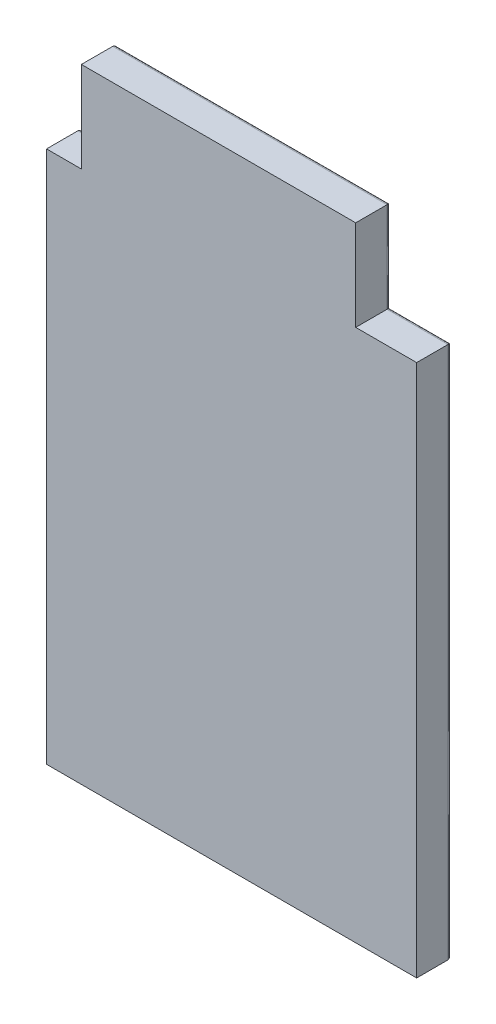
ISO-10303-21;
HEADER;
FILE_DESCRIPTION(('STEP AP214'),'2;1');
FILE_NAME('part.step','',(''),(''),'','','');
FILE_SCHEMA(('AUTOMOTIVE_DESIGN { 1 0 10303 214 1 1 1 1 }'));
ENDSEC;
DATA;
#1=APPLICATION_CONTEXT('core data for automotive mechanical design processes');
#2=APPLICATION_PROTOCOL_DEFINITION('international standard','automotive_design',2000,#1);
#3=PRODUCT_CONTEXT('',#1,'mechanical');
#4=PRODUCT('Part','Part','',(#3));
#5=PRODUCT_RELATED_PRODUCT_CATEGORY('part','',(#4));
#6=PRODUCT_DEFINITION_FORMATION('','',#4);
#7=PRODUCT_DEFINITION_CONTEXT('part definition',#1,'design');
#8=PRODUCT_DEFINITION('design','',#6,#7);
#9=PRODUCT_DEFINITION_SHAPE('','',#8);
#10=(LENGTH_UNIT() NAMED_UNIT(*) SI_UNIT(.MILLI.,.METRE.));
#11=(NAMED_UNIT(*) PLANE_ANGLE_UNIT() SI_UNIT($,.RADIAN.));
#12=(NAMED_UNIT(*) SI_UNIT($,.STERADIAN.) SOLID_ANGLE_UNIT());
#13=UNCERTAINTY_MEASURE_WITH_UNIT(LENGTH_MEASURE(1.E-05),#10,'distance_accuracy_value','');
#14=(GEOMETRIC_REPRESENTATION_CONTEXT(3) GLOBAL_UNCERTAINTY_ASSIGNED_CONTEXT((#13)) GLOBAL_UNIT_ASSIGNED_CONTEXT((#10,
#11,#12)) REPRESENTATION_CONTEXT('',''));
#15=CARTESIAN_POINT('',(0.,0.,0.));
#16=DIRECTION('',(0.,0.,1.));
#17=DIRECTION('',(1.,0.,0.));
#18=AXIS2_PLACEMENT_3D('',#15,#16,#17);
#19=CARTESIAN_POINT('',(4.868530469244,-3.958623226943,23.298881449435));
#20=DIRECTION('',(0.,0.,-1.));
#21=DIRECTION('',(0.,1.,0.));
#22=AXIS2_PLACEMENT_3D('',#19,#20,#21);
#23=PLANE('',#22);
#24=DIRECTION('',(0.,-1.,0.));
#25=VECTOR('',#24,1.);
#26=CARTESIAN_POINT('',(7.818530469244,-3.958623226943,23.298881449435));
#27=LINE('',#26,#25);
#28=CARTESIAN_POINT('',(7.818530469244,33.191376773057,23.298881449435));
#29=VERTEX_POINT('',#28);
#30=CARTESIAN_POINT('',(7.818530469244,2.991376773057,23.298881449435));
#31=VERTEX_POINT('',#30);
#32=EDGE_CURVE('E164',#29,#31,#27,.T.);
#33=ORIENTED_EDGE('',*,*,#32,.F.);
#34=DIRECTION('',(-1.,0.,0.));
#35=VECTOR('',#34,1.);
#36=CARTESIAN_POINT('',(4.868530469244,33.191376773057,23.298881449435));
#37=LINE('',#36,#35);
#38=CARTESIAN_POINT('',(9.818530469244,33.191376773057,23.298881449435));
#39=VERTEX_POINT('',#38);
#40=EDGE_CURVE('E163',#39,#29,#37,.T.);
#41=ORIENTED_EDGE('',*,*,#40,.F.);
#42=DIRECTION('',(0.,-1.,0.));
#43=VECTOR('',#42,1.);
#44=CARTESIAN_POINT('',(9.818530469244,-3.958623226943,23.298881449435));
#45=LINE('',#44,#43);
#46=CARTESIAN_POINT('',(9.818530469244,38.391376773057,23.298881449435));
#47=VERTEX_POINT('',#46);
#48=EDGE_CURVE('E161',#47,#39,#45,.T.);
#49=ORIENTED_EDGE('',*,*,#48,.F.);
#50=DIRECTION('',(-1.,0.,0.));
#51=VECTOR('',#50,1.);
#52=CARTESIAN_POINT('',(4.868530469244,38.391376773057,23.298881449435));
#53=LINE('',#52,#51);
#54=CARTESIAN_POINT('',(25.168530469244,38.391376773057,23.298881449435));
#55=VERTEX_POINT('',#54);
#56=EDGE_CURVE('E158',#55,#47,#53,.T.);
#57=ORIENTED_EDGE('',*,*,#56,.F.);
#58=DIRECTION('',(0.,1.,0.));
#59=VECTOR('',#58,1.);
#60=CARTESIAN_POINT('',(25.168530469244,-3.958623226943,23.298881449435));
#61=LINE('',#60,#59);
#62=CARTESIAN_POINT('',(25.168530469244,33.191376773057,23.298881449435));
#63=VERTEX_POINT('',#62);
#64=EDGE_CURVE('E155',#63,#55,#61,.T.);
#65=ORIENTED_EDGE('',*,*,#64,.F.);
#66=DIRECTION('',(-1.,0.,0.));
#67=VECTOR('',#66,1.);
#68=CARTESIAN_POINT('',(4.868530469244,33.191376773057,23.298881449435));
#69=LINE('',#68,#67);
#70=CARTESIAN_POINT('',(28.668530469244,33.191376773057,23.298881449435));
#71=VERTEX_POINT('',#70);
#72=EDGE_CURVE('E108',#71,#63,#69,.T.);
#73=ORIENTED_EDGE('',*,*,#72,.F.);
#74=DIRECTION('',(0.,1.,0.));
#75=VECTOR('',#74,1.);
#76=CARTESIAN_POINT('',(28.668530469244,-3.958623226943,23.298881449435));
#77=LINE('',#76,#75);
#78=CARTESIAN_POINT('',(28.668530469244,2.991376773057,23.298881449435));
#79=VERTEX_POINT('',#78);
#80=EDGE_CURVE('E102',#79,#71,#77,.T.);
#81=ORIENTED_EDGE('',*,*,#80,.F.);
#82=DIRECTION('',(1.,0.,0.));
#83=VECTOR('',#82,1.);
#84=CARTESIAN_POINT('',(4.868530469244,2.991376773057,23.298881449435));
#85=LINE('',#84,#83);
#86=EDGE_CURVE('E105',#31,#79,#85,.T.);
#87=ORIENTED_EDGE('',*,*,#86,.F.);
#88=EDGE_LOOP('',(#33,#41,#49,#57,#65,#73,#81,#87));
#89=FACE_BOUND('',#88,.T.);
#90=ADVANCED_FACE('F17',(#89),#23,.T.);
#91=CARTESIAN_POINT('',(28.668530469244,-3.958623226943,23.498881449435));
#92=DIRECTION('',(0.,1.,0.));
#93=DIRECTION('',(-1.,0.,0.));
#94=AXIS2_PLACEMENT_3D('',#91,#92,#93);
#95=CYLINDRICAL_SURFACE('',#94,0.199999999999999);
#96=CARTESIAN_POINT('',(28.668530469244,2.991376773057,23.498881449435));
#97=DIRECTION('',(0.707106781186548,0.707106781186547,0.));
#98=DIRECTION('',(0.707106781186547,-0.707106781186548,0.));
#99=AXIS2_PLACEMENT_3D('',#96,#97,#98);
#100=ELLIPSE('',#99,0.282842712474617,0.199999999999999);
#101=CARTESIAN_POINT('',(28.868530469244,2.791376773057,23.498881449435));
#102=VERTEX_POINT('',#101);
#103=EDGE_CURVE('E20',#79,#102,#100,.F.);
#104=ORIENTED_EDGE('',*,*,#103,.F.);
#105=ORIENTED_EDGE('',*,*,#80,.T.);
#106=CARTESIAN_POINT('',(28.668530469244,33.191376773057,23.498881449435));
#107=DIRECTION('',(-0.707106781186547,0.707106781186548,0.));
#108=DIRECTION('',(-0.707106781186548,-0.707106781186547,0.));
#109=AXIS2_PLACEMENT_3D('',#106,#107,#108);
#110=ELLIPSE('',#109,0.282842712474617,0.199999999999999);
#111=CARTESIAN_POINT('',(28.868530469244,33.391376773057,23.498881449435));
#112=VERTEX_POINT('',#111);
#113=EDGE_CURVE('E125',#112,#71,#110,.T.);
#114=ORIENTED_EDGE('',*,*,#113,.F.);
#115=DIRECTION('',(0.,-1.,0.));
#116=VECTOR('',#115,1.);
#117=CARTESIAN_POINT('',(28.868530469244,33.391376773057,23.498881449435));
#118=LINE('',#117,#116);
#119=EDGE_CURVE('E123',#112,#102,#118,.T.);
#120=ORIENTED_EDGE('',*,*,#119,.T.);
#121=EDGE_LOOP('',(#104,#105,#114,#120));
#122=FACE_BOUND('',#121,.T.);
#123=ADVANCED_FACE('F122',(#122),#95,.T.);
#124=CARTESIAN_POINT('',(4.868530469244,2.991376773057,23.498881449435));
#125=DIRECTION('',(1.,0.,0.));
#126=DIRECTION('',(0.,0.,-1.));
#127=AXIS2_PLACEMENT_3D('',#124,#125,#126);
#128=CYLINDRICAL_SURFACE('',#127,0.199999999999999);
#129=CARTESIAN_POINT('',(7.818530469244,2.991376773057,23.498881449435));
#130=DIRECTION('',(0.707106781186547,-0.707106781186547,0.));
#131=DIRECTION('',(-0.707106781186547,-0.707106781186547,0.));
#132=AXIS2_PLACEMENT_3D('',#129,#130,#131);
#133=ELLIPSE('',#132,0.282842712474617,0.199999999999999);
#134=CARTESIAN_POINT('',(7.618530469244,2.791376773057,23.498881449435));
#135=VERTEX_POINT('',#134);
#136=EDGE_CURVE('E120',#31,#135,#133,.F.);
#137=ORIENTED_EDGE('',*,*,#136,.F.);
#138=ORIENTED_EDGE('',*,*,#86,.T.);
#139=ORIENTED_EDGE('',*,*,#103,.T.);
#140=DIRECTION('',(1.,0.,0.));
#141=VECTOR('',#140,1.);
#142=CARTESIAN_POINT('',(28.868530469244,2.791376773057,23.498881449435));
#143=LINE('',#142,#141);
#144=EDGE_CURVE('E136',#102,#135,#143,.F.);
#145=ORIENTED_EDGE('',*,*,#144,.T.);
#146=EDGE_LOOP('',(#137,#138,#139,#145));
#147=FACE_BOUND('',#146,.T.);
#148=ADVANCED_FACE('F117',(#147),#128,.T.);
#149=CARTESIAN_POINT('',(7.818530469244,-3.958623226943,23.498881449435));
#150=DIRECTION('',(0.,-1.,0.));
#151=DIRECTION('',(0.,0.,-1.));
#152=AXIS2_PLACEMENT_3D('',#149,#150,#151);
#153=CYLINDRICAL_SURFACE('',#152,0.199999999999999);
#154=CARTESIAN_POINT('',(7.818530469244,33.191376773057,23.498881449435));
#155=DIRECTION('',(-0.707106781186547,-0.707106781186547,0.));
#156=DIRECTION('',(-0.707106781186547,0.707106781186547,0.));
#157=AXIS2_PLACEMENT_3D('',#154,#155,#156);
#158=ELLIPSE('',#157,0.282842712474617,0.199999999999999);
#159=CARTESIAN_POINT('',(7.618530469244,33.391376773057,23.498881449435));
#160=VERTEX_POINT('',#159);
#161=EDGE_CURVE('E162',#29,#160,#158,.F.);
#162=ORIENTED_EDGE('',*,*,#161,.F.);
#163=ORIENTED_EDGE('',*,*,#32,.T.);
#164=ORIENTED_EDGE('',*,*,#136,.T.);
#165=DIRECTION('',(0.,1.,0.));
#166=VECTOR('',#165,1.);
#167=CARTESIAN_POINT('',(7.618530469244,2.791376773057,23.498881449435));
#168=LINE('',#167,#166);
#169=EDGE_CURVE('E175',#135,#160,#168,.T.);
#170=ORIENTED_EDGE('',*,*,#169,.T.);
#171=EDGE_LOOP('',(#162,#163,#164,#170));
#172=FACE_BOUND('',#171,.T.);
#173=ADVANCED_FACE('F238',(#172),#153,.T.);
#174=CARTESIAN_POINT('',(4.868530469244,33.191376773057,23.498881449435));
#175=DIRECTION('',(-1.,0.,0.));
#176=DIRECTION('',(0.,0.,1.));
#177=AXIS2_PLACEMENT_3D('',#174,#175,#176);
#178=CYLINDRICAL_SURFACE('',#177,0.199999999999999);
#179=ORIENTED_EDGE('',*,*,#161,.T.);
#180=DIRECTION('',(1.,0.,0.));
#181=VECTOR('',#180,1.);
#182=CARTESIAN_POINT('',(7.618530469244,33.391376773057,23.498881449435));
#183=LINE('',#182,#181);
#184=CARTESIAN_POINT('',(9.618530469244,33.391376773057,23.498881449435));
#185=VERTEX_POINT('',#184);
#186=EDGE_CURVE('E223',#160,#185,#183,.T.);
#187=ORIENTED_EDGE('',*,*,#186,.T.);
#188=CARTESIAN_POINT('',(9.818530469244,33.191376773057,23.498881449435));
#189=DIRECTION('',(-0.707106781186547,-0.707106781186547,0.));
#190=DIRECTION('',(-0.707106781186547,0.707106781186547,0.));
#191=AXIS2_PLACEMENT_3D('',#188,#189,#190);
#192=ELLIPSE('',#191,0.282842712474617,0.199999999999999);
#193=EDGE_CURVE('E159',#39,#185,#192,.F.);
#194=ORIENTED_EDGE('',*,*,#193,.F.);
#195=ORIENTED_EDGE('',*,*,#40,.T.);
#196=EDGE_LOOP('',(#179,#187,#194,#195));
#197=FACE_BOUND('',#196,.T.);
#198=ADVANCED_FACE('F287',(#197),#178,.T.);
#199=CARTESIAN_POINT('',(9.818530469244,-3.958623226943,23.498881449435));
#200=DIRECTION('',(0.,-1.,0.));
#201=DIRECTION('',(0.,0.,-1.));
#202=AXIS2_PLACEMENT_3D('',#199,#200,#201);
#203=CYLINDRICAL_SURFACE('',#202,0.199999999999999);
#204=ORIENTED_EDGE('',*,*,#193,.T.);
#205=DIRECTION('',(0.,1.,0.));
#206=VECTOR('',#205,1.);
#207=CARTESIAN_POINT('',(9.618530469244,33.391376773057,23.498881449435));
#208=LINE('',#207,#206);
#209=CARTESIAN_POINT('',(9.618530469244,38.591376773057,23.498881449435));
#210=VERTEX_POINT('',#209);
#211=EDGE_CURVE('E210',#185,#210,#208,.T.);
#212=ORIENTED_EDGE('',*,*,#211,.T.);
#213=CARTESIAN_POINT('',(9.818530469244,38.391376773057,23.498881449435));
#214=DIRECTION('',(-0.707106781186547,-0.707106781186547,0.));
#215=DIRECTION('',(-0.707106781186547,0.707106781186547,0.));
#216=AXIS2_PLACEMENT_3D('',#213,#214,#215);
#217=ELLIPSE('',#216,0.282842712474617,0.199999999999999);
#218=EDGE_CURVE('E156',#47,#210,#217,.F.);
#219=ORIENTED_EDGE('',*,*,#218,.F.);
#220=ORIENTED_EDGE('',*,*,#48,.T.);
#221=EDGE_LOOP('',(#204,#212,#219,#220));
#222=FACE_BOUND('',#221,.T.);
#223=ADVANCED_FACE('F258',(#222),#203,.T.);
#224=CARTESIAN_POINT('',(4.868530469244,38.391376773057,23.498881449435));
#225=DIRECTION('',(-1.,0.,0.));
#226=DIRECTION('',(0.,0.,1.));
#227=AXIS2_PLACEMENT_3D('',#224,#225,#226);
#228=CYLINDRICAL_SURFACE('',#227,0.199999999999999);
#229=ORIENTED_EDGE('',*,*,#218,.T.);
#230=DIRECTION('',(1.,0.,0.));
#231=VECTOR('',#230,1.);
#232=CARTESIAN_POINT('',(9.618530469244,38.591376773057,23.498881449435));
#233=LINE('',#232,#231);
#234=CARTESIAN_POINT('',(25.368530469244,38.591376773057,23.498881449435));
#235=VERTEX_POINT('',#234);
#236=EDGE_CURVE('E195',#210,#235,#233,.T.);
#237=ORIENTED_EDGE('',*,*,#236,.T.);
#238=CARTESIAN_POINT('',(25.168530469244,38.391376773057,23.498881449435));
#239=DIRECTION('',(-0.707106781186548,0.707106781186547,0.));
#240=DIRECTION('',(0.707106781186547,0.707106781186548,0.));
#241=AXIS2_PLACEMENT_3D('',#238,#239,#240);
#242=ELLIPSE('',#241,0.282842712474617,0.199999999999999);
#243=EDGE_CURVE('E153',#55,#235,#242,.F.);
#244=ORIENTED_EDGE('',*,*,#243,.F.);
#245=ORIENTED_EDGE('',*,*,#56,.T.);
#246=EDGE_LOOP('',(#229,#237,#244,#245));
#247=FACE_BOUND('',#246,.T.);
#248=ADVANCED_FACE('F264',(#247),#228,.T.);
#249=CARTESIAN_POINT('',(25.168530469244,-3.958623226943,23.498881449435));
#250=DIRECTION('',(0.,1.,0.));
#251=DIRECTION('',(-1.,0.,0.));
#252=AXIS2_PLACEMENT_3D('',#249,#250,#251);
#253=CYLINDRICAL_SURFACE('',#252,0.199999999999999);
#254=ORIENTED_EDGE('',*,*,#243,.T.);
#255=DIRECTION('',(0.,-1.,0.));
#256=VECTOR('',#255,1.);
#257=CARTESIAN_POINT('',(25.368530469244,38.591376773057,23.498881449435));
#258=LINE('',#257,#256);
#259=CARTESIAN_POINT('',(25.368530469244,33.391376773057,23.498881449435));
#260=VERTEX_POINT('',#259);
#261=EDGE_CURVE('E194',#235,#260,#258,.T.);
#262=ORIENTED_EDGE('',*,*,#261,.T.);
#263=CARTESIAN_POINT('',(25.168530469244,33.191376773057,23.498881449435));
#264=DIRECTION('',(-0.707106781186548,0.707106781186547,0.));
#265=DIRECTION('',(-0.707106781186547,-0.707106781186548,0.));
#266=AXIS2_PLACEMENT_3D('',#263,#264,#265);
#267=ELLIPSE('',#266,0.282842712474617,0.199999999999999);
#268=EDGE_CURVE('E132',#63,#260,#267,.F.);
#269=ORIENTED_EDGE('',*,*,#268,.F.);
#270=ORIENTED_EDGE('',*,*,#64,.T.);
#271=EDGE_LOOP('',(#254,#262,#269,#270));
#272=FACE_BOUND('',#271,.T.);
#273=ADVANCED_FACE('F283',(#272),#253,.T.);
#274=CARTESIAN_POINT('',(4.868530469244,33.191376773057,23.498881449435));
#275=DIRECTION('',(-1.,0.,0.));
#276=DIRECTION('',(0.,0.,1.));
#277=AXIS2_PLACEMENT_3D('',#274,#275,#276);
#278=CYLINDRICAL_SURFACE('',#277,0.199999999999999);
#279=ORIENTED_EDGE('',*,*,#268,.T.);
#280=DIRECTION('',(1.,0.,0.));
#281=VECTOR('',#280,1.);
#282=CARTESIAN_POINT('',(25.368530469244,33.391376773057,23.498881449435));
#283=LINE('',#282,#281);
#284=EDGE_CURVE('E183',#260,#112,#283,.T.);
#285=ORIENTED_EDGE('',*,*,#284,.T.);
#286=ORIENTED_EDGE('',*,*,#113,.T.);
#287=ORIENTED_EDGE('',*,*,#72,.T.);
#288=EDGE_LOOP('',(#279,#285,#286,#287));
#289=FACE_BOUND('',#288,.T.);
#290=ADVANCED_FACE('F282',(#289),#278,.T.);
#291=CARTESIAN_POINT('',(28.868530469244,33.391376773057,23.298881449435));
#292=DIRECTION('',(-1.,0.,0.));
#293=DIRECTION('',(0.,-1.,0.));
#294=AXIS2_PLACEMENT_3D('',#291,#292,#293);
#295=PLANE('',#294);
#296=DIRECTION('',(0.,0.,-1.));
#297=VECTOR('',#296,1.);
#298=CARTESIAN_POINT('',(28.868530469244,33.391376773057,23.298881449435));
#299=LINE('',#298,#297);
#300=CARTESIAN_POINT('',(28.868530469244,33.391376773057,25.298881449435));
#301=VERTEX_POINT('',#300);
#302=EDGE_CURVE('E271',#112,#301,#299,.F.);
#303=ORIENTED_EDGE('',*,*,#302,.T.);
#304=DIRECTION('',(0.,1.,0.));
#305=VECTOR('',#304,1.);
#306=CARTESIAN_POINT('',(28.868530469244,-3.958623226943,25.298881449435));
#307=LINE('',#306,#305);
#308=CARTESIAN_POINT('',(28.868530469244,2.791376773057,25.298881449435));
#309=VERTEX_POINT('',#308);
#310=EDGE_CURVE('E145',#301,#309,#307,.F.);
#311=ORIENTED_EDGE('',*,*,#310,.T.);
#312=DIRECTION('',(0.,0.,1.));
#313=VECTOR('',#312,1.);
#314=CARTESIAN_POINT('',(28.868530469244,2.791376773057,23.298881449435));
#315=LINE('',#314,#313);
#316=EDGE_CURVE('E131',#309,#102,#315,.F.);
#317=ORIENTED_EDGE('',*,*,#316,.T.);
#318=ORIENTED_EDGE('',*,*,#119,.F.);
#319=EDGE_LOOP('',(#303,#311,#317,#318));
#320=FACE_BOUND('',#319,.T.);
#321=ADVANCED_FACE('F144',(#320),#295,.F.);
#322=CARTESIAN_POINT('',(28.868530469244,2.791376773057,23.298881449435));
#323=DIRECTION('',(0.,1.,0.));
#324=DIRECTION('',(0.,0.,1.));
#325=AXIS2_PLACEMENT_3D('',#322,#323,#324);
#326=PLANE('',#325);
#327=ORIENTED_EDGE('',*,*,#316,.F.);
#328=DIRECTION('',(1.,0.,0.));
#329=VECTOR('',#328,1.);
#330=CARTESIAN_POINT('',(4.868530469244,2.791376773057,25.298881449435));
#331=LINE('',#330,#329);
#332=CARTESIAN_POINT('',(7.618530469244,2.791376773057,25.298881449435));
#333=VERTEX_POINT('',#332);
#334=EDGE_CURVE('E178',#309,#333,#331,.F.);
#335=ORIENTED_EDGE('',*,*,#334,.T.);
#336=DIRECTION('',(0.,0.,-1.));
#337=VECTOR('',#336,1.);
#338=CARTESIAN_POINT('',(7.618530469244,2.791376773057,23.298881449435));
#339=LINE('',#338,#337);
#340=EDGE_CURVE('E140',#333,#135,#339,.T.);
#341=ORIENTED_EDGE('',*,*,#340,.T.);
#342=ORIENTED_EDGE('',*,*,#144,.F.);
#343=EDGE_LOOP('',(#327,#335,#341,#342));
#344=FACE_BOUND('',#343,.T.);
#345=ADVANCED_FACE('F137',(#344),#326,.F.);
#346=CARTESIAN_POINT('',(7.618530469244,2.791376773057,23.298881449435));
#347=DIRECTION('',(1.,0.,0.));
#348=DIRECTION('',(0.,0.,-1.));
#349=AXIS2_PLACEMENT_3D('',#346,#347,#348);
#350=PLANE('',#349);
#351=ORIENTED_EDGE('',*,*,#340,.F.);
#352=DIRECTION('',(0.,1.,0.));
#353=VECTOR('',#352,1.);
#354=CARTESIAN_POINT('',(7.618530469244,-3.958623226943,25.298881449435));
#355=LINE('',#354,#353);
#356=CARTESIAN_POINT('',(7.618530469244,33.391376773057,25.298881449435));
#357=VERTEX_POINT('',#356);
#358=EDGE_CURVE('E179',#333,#357,#355,.T.);
#359=ORIENTED_EDGE('',*,*,#358,.T.);
#360=DIRECTION('',(0.,0.,-1.));
#361=VECTOR('',#360,1.);
#362=CARTESIAN_POINT('',(7.618530469244,33.391376773057,23.298881449435));
#363=LINE('',#362,#361);
#364=EDGE_CURVE('E228',#357,#160,#363,.T.);
#365=ORIENTED_EDGE('',*,*,#364,.T.);
#366=ORIENTED_EDGE('',*,*,#169,.F.);
#367=EDGE_LOOP('',(#351,#359,#365,#366));
#368=FACE_BOUND('',#367,.T.);
#369=ADVANCED_FACE('F246',(#368),#350,.F.);
#370=CARTESIAN_POINT('',(7.618530469244,33.391376773057,23.298881449435));
#371=DIRECTION('',(0.,-1.,0.));
#372=DIRECTION('',(0.,0.,-1.));
#373=AXIS2_PLACEMENT_3D('',#370,#371,#372);
#374=PLANE('',#373);
#375=ORIENTED_EDGE('',*,*,#364,.F.);
#376=DIRECTION('',(1.,0.,0.));
#377=VECTOR('',#376,1.);
#378=CARTESIAN_POINT('',(4.868530469244,33.391376773057,25.298881449435));
#379=LINE('',#378,#377);
#380=CARTESIAN_POINT('',(9.618530469244,33.391376773057,25.298881449435));
#381=VERTEX_POINT('',#380);
#382=EDGE_CURVE('E182',#357,#381,#379,.T.);
#383=ORIENTED_EDGE('',*,*,#382,.T.);
#384=DIRECTION('',(0.,0.,-1.));
#385=VECTOR('',#384,1.);
#386=CARTESIAN_POINT('',(9.618530469244,33.391376773057,23.298881449435));
#387=LINE('',#386,#385);
#388=EDGE_CURVE('E215',#381,#185,#387,.T.);
#389=ORIENTED_EDGE('',*,*,#388,.T.);
#390=ORIENTED_EDGE('',*,*,#186,.F.);
#391=EDGE_LOOP('',(#375,#383,#389,#390));
#392=FACE_BOUND('',#391,.T.);
#393=ADVANCED_FACE('F241',(#392),#374,.F.);
#394=CARTESIAN_POINT('',(9.618530469244,33.391376773057,23.298881449435));
#395=DIRECTION('',(1.,0.,0.));
#396=DIRECTION('',(0.,0.,-1.));
#397=AXIS2_PLACEMENT_3D('',#394,#395,#396);
#398=PLANE('',#397);
#399=ORIENTED_EDGE('',*,*,#388,.F.);
#400=DIRECTION('',(0.,1.,0.));
#401=VECTOR('',#400,1.);
#402=CARTESIAN_POINT('',(9.618530469244,-3.958623226943,25.298881449435));
#403=LINE('',#402,#401);
#404=CARTESIAN_POINT('',(9.618530469244,38.591376773057,25.298881449435));
#405=VERTEX_POINT('',#404);
#406=EDGE_CURVE('E204',#381,#405,#403,.T.);
#407=ORIENTED_EDGE('',*,*,#406,.T.);
#408=DIRECTION('',(0.,0.,-1.));
#409=VECTOR('',#408,1.);
#410=CARTESIAN_POINT('',(9.618530469244,38.591376773057,23.298881449435));
#411=LINE('',#410,#409);
#412=EDGE_CURVE('E200',#405,#210,#411,.T.);
#413=ORIENTED_EDGE('',*,*,#412,.T.);
#414=ORIENTED_EDGE('',*,*,#211,.F.);
#415=EDGE_LOOP('',(#399,#407,#413,#414));
#416=FACE_BOUND('',#415,.T.);
#417=ADVANCED_FACE('F254',(#416),#398,.F.);
#418=CARTESIAN_POINT('',(9.618530469244,38.591376773057,23.298881449435));
#419=DIRECTION('',(0.,-1.,0.));
#420=DIRECTION('',(0.,0.,-1.));
#421=AXIS2_PLACEMENT_3D('',#418,#419,#420);
#422=PLANE('',#421);
#423=ORIENTED_EDGE('',*,*,#412,.F.);
#424=DIRECTION('',(1.,0.,0.));
#425=VECTOR('',#424,1.);
#426=CARTESIAN_POINT('',(4.868530469244,38.591376773057,25.298881449435));
#427=LINE('',#426,#425);
#428=CARTESIAN_POINT('',(25.368530469244,38.591376773057,25.298881449435));
#429=VERTEX_POINT('',#428);
#430=EDGE_CURVE('E201',#405,#429,#427,.T.);
#431=ORIENTED_EDGE('',*,*,#430,.T.);
#432=DIRECTION('',(0.,0.,1.));
#433=VECTOR('',#432,1.);
#434=CARTESIAN_POINT('',(25.368530469244,38.591376773057,23.298881449435));
#435=LINE('',#434,#433);
#436=EDGE_CURVE('E191',#429,#235,#435,.F.);
#437=ORIENTED_EDGE('',*,*,#436,.T.);
#438=ORIENTED_EDGE('',*,*,#236,.F.);
#439=EDGE_LOOP('',(#423,#431,#437,#438));
#440=FACE_BOUND('',#439,.T.);
#441=ADVANCED_FACE('F260',(#440),#422,.F.);
#442=CARTESIAN_POINT('',(25.368530469244,38.591376773057,23.298881449435));
#443=DIRECTION('',(-1.,0.,0.));
#444=DIRECTION('',(0.,-1.,0.));
#445=AXIS2_PLACEMENT_3D('',#442,#443,#444);
#446=PLANE('',#445);
#447=ORIENTED_EDGE('',*,*,#436,.F.);
#448=DIRECTION('',(0.,1.,0.));
#449=VECTOR('',#448,1.);
#450=CARTESIAN_POINT('',(25.368530469244,-3.958623226943,25.298881449435));
#451=LINE('',#450,#449);
#452=CARTESIAN_POINT('',(25.368530469244,33.391376773057,25.298881449435));
#453=VERTEX_POINT('',#452);
#454=EDGE_CURVE('E26',#429,#453,#451,.F.);
#455=ORIENTED_EDGE('',*,*,#454,.T.);
#456=DIRECTION('',(0.,0.,-1.));
#457=VECTOR('',#456,1.);
#458=CARTESIAN_POINT('',(25.368530469244,33.391376773057,23.298881449435));
#459=LINE('',#458,#457);
#460=EDGE_CURVE('E34',#453,#260,#459,.T.);
#461=ORIENTED_EDGE('',*,*,#460,.T.);
#462=ORIENTED_EDGE('',*,*,#261,.F.);
#463=EDGE_LOOP('',(#447,#455,#461,#462));
#464=FACE_BOUND('',#463,.T.);
#465=ADVANCED_FACE('F267',(#464),#446,.F.);
#466=CARTESIAN_POINT('',(25.368530469244,33.391376773057,23.298881449435));
#467=DIRECTION('',(0.,-1.,0.));
#468=DIRECTION('',(0.,0.,-1.));
#469=AXIS2_PLACEMENT_3D('',#466,#467,#468);
#470=PLANE('',#469);
#471=ORIENTED_EDGE('',*,*,#460,.F.);
#472=DIRECTION('',(1.,0.,0.));
#473=VECTOR('',#472,1.);
#474=CARTESIAN_POINT('',(4.868530469244,33.391376773057,25.298881449435));
#475=LINE('',#474,#473);
#476=EDGE_CURVE('E11',#453,#301,#475,.T.);
#477=ORIENTED_EDGE('',*,*,#476,.T.);
#478=ORIENTED_EDGE('',*,*,#302,.F.);
#479=ORIENTED_EDGE('',*,*,#284,.F.);
#480=EDGE_LOOP('',(#471,#477,#478,#479));
#481=FACE_BOUND('',#480,.T.);
#482=ADVANCED_FACE('F280',(#481),#470,.F.);
#483=CARTESIAN_POINT('',(4.868530469244,-3.958623226943,25.298881449435));
#484=DIRECTION('',(0.,0.,-1.));
#485=DIRECTION('',(0.,1.,0.));
#486=AXIS2_PLACEMENT_3D('',#483,#484,#485);
#487=PLANE('',#486);
#488=ORIENTED_EDGE('',*,*,#454,.F.);
#489=ORIENTED_EDGE('',*,*,#430,.F.);
#490=ORIENTED_EDGE('',*,*,#406,.F.);
#491=ORIENTED_EDGE('',*,*,#382,.F.);
#492=ORIENTED_EDGE('',*,*,#358,.F.);
#493=ORIENTED_EDGE('',*,*,#334,.F.);
#494=ORIENTED_EDGE('',*,*,#310,.F.);
#495=ORIENTED_EDGE('',*,*,#476,.F.);
#496=EDGE_LOOP('',(#488,#489,#490,#491,#492,#493,#494,#495));
#497=FACE_BOUND('',#496,.T.);
#498=ADVANCED_FACE('F250',(#497),#487,.F.);
#499=CLOSED_SHELL('',(#90,#123,#148,#173,#198,#223,#248,#273,#290,#321,#345,#369,#393,#417,#441,
#465,#482,#498));
#500=MANIFOLD_SOLID_BREP('B1',#499);
#501=ADVANCED_BREP_SHAPE_REPRESENTATION('',(#18,#500),#14);
#502=SHAPE_DEFINITION_REPRESENTATION(#9,#501);
ENDSEC;
END-ISO-10303-21;
